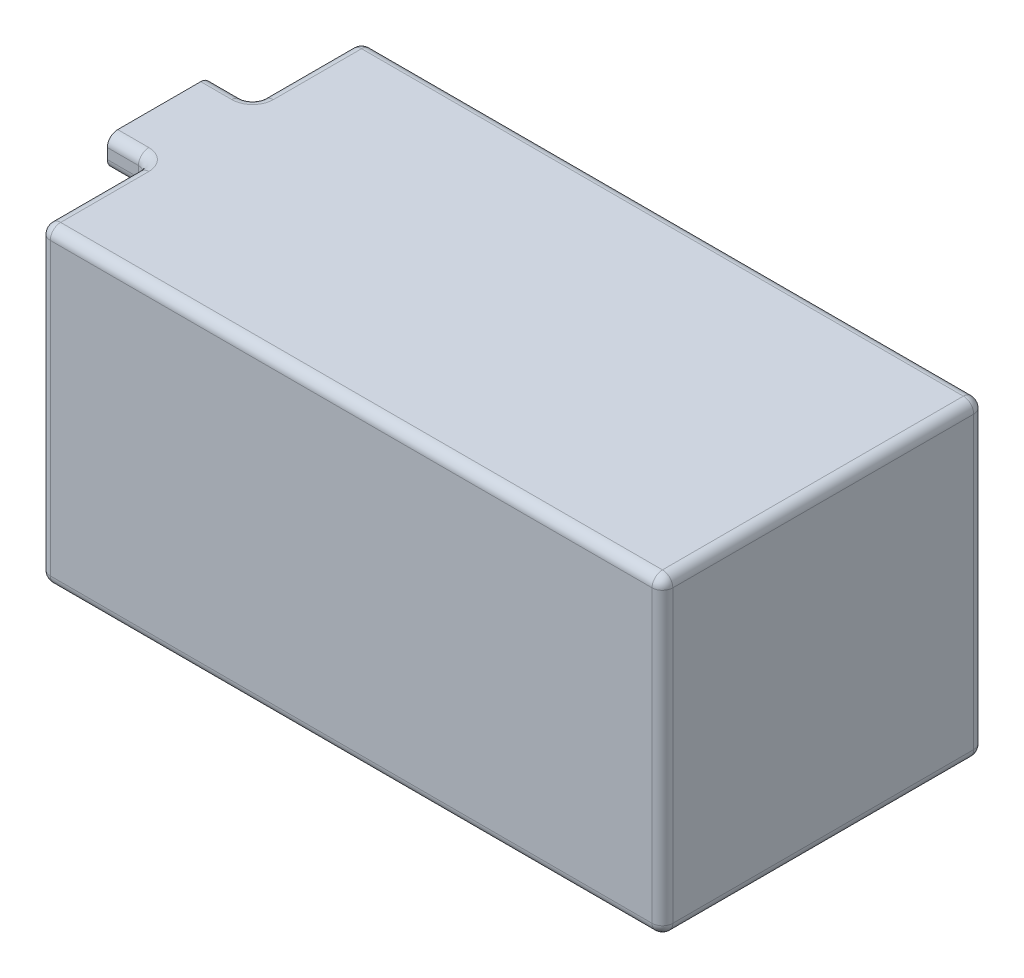
ISO-10303-21;
HEADER;
FILE_DESCRIPTION(('STEP AP214'),'2;1');
FILE_NAME('part.step','',(''),(''),'','','');
FILE_SCHEMA(('AUTOMOTIVE_DESIGN { 1 0 10303 214 1 1 1 1 }'));
ENDSEC;
DATA;
#1=APPLICATION_CONTEXT('core data for automotive mechanical design processes');
#2=APPLICATION_PROTOCOL_DEFINITION('international standard','automotive_design',2000,#1);
#3=PRODUCT_CONTEXT('',#1,'mechanical');
#4=PRODUCT('Part','Part','',(#3));
#5=PRODUCT_RELATED_PRODUCT_CATEGORY('part','',(#4));
#6=PRODUCT_DEFINITION_FORMATION('','',#4);
#7=PRODUCT_DEFINITION_CONTEXT('part definition',#1,'design');
#8=PRODUCT_DEFINITION('design','',#6,#7);
#9=PRODUCT_DEFINITION_SHAPE('','',#8);
#10=(LENGTH_UNIT() NAMED_UNIT(*) SI_UNIT(.MILLI.,.METRE.));
#11=(NAMED_UNIT(*) PLANE_ANGLE_UNIT() SI_UNIT($,.RADIAN.));
#12=(NAMED_UNIT(*) SI_UNIT($,.STERADIAN.) SOLID_ANGLE_UNIT());
#13=UNCERTAINTY_MEASURE_WITH_UNIT(LENGTH_MEASURE(1.E-05),#10,'distance_accuracy_value','');
#14=(GEOMETRIC_REPRESENTATION_CONTEXT(3) GLOBAL_UNCERTAINTY_ASSIGNED_CONTEXT((#13)) GLOBAL_UNIT_ASSIGNED_CONTEXT((#10,
#11,#12)) REPRESENTATION_CONTEXT('',''));
#15=CARTESIAN_POINT('',(0.,0.,0.));
#16=DIRECTION('',(0.,0.,1.));
#17=DIRECTION('',(1.,0.,0.));
#18=AXIS2_PLACEMENT_3D('',#15,#16,#17);
#19=CARTESIAN_POINT('',(-38.1,38.1,19.685));
#20=DIRECTION('',(1.,0.,0.));
#21=DIRECTION('',(0.,0.,-1.));
#22=AXIS2_PLACEMENT_3D('',#19,#20,#21);
#23=PLANE('',#22);
#24=DIRECTION('',(0.,0.,1.));
#25=VECTOR('',#24,1.);
#26=CARTESIAN_POINT('',(-38.1,1.27,19.685));
#27=LINE('',#26,#25);
#28=CARTESIAN_POINT('',(-38.1,1.27,-18.415));
#29=VERTEX_POINT('',#28);
#30=CARTESIAN_POINT('',(-38.1,1.27,18.415));
#31=VERTEX_POINT('',#30);
#32=EDGE_CURVE('E271',#29,#31,#27,.T.);
#33=ORIENTED_EDGE('',*,*,#32,.T.);
#34=DIRECTION('',(0.,-1.,0.));
#35=VECTOR('',#34,1.);
#36=CARTESIAN_POINT('',(-38.1,38.1,18.415));
#37=LINE('',#36,#35);
#38=CARTESIAN_POINT('',(-38.1,36.83,18.415));
#39=VERTEX_POINT('',#38);
#40=EDGE_CURVE('E275',#31,#39,#37,.F.);
#41=ORIENTED_EDGE('',*,*,#40,.T.);
#42=DIRECTION('',(0.,0.,1.));
#43=VECTOR('',#42,1.);
#44=CARTESIAN_POINT('',(-38.1,36.83,19.685));
#45=LINE('',#44,#43);
#46=CARTESIAN_POINT('',(-38.1,36.83,7.62));
#47=VERTEX_POINT('',#46);
#48=EDGE_CURVE('E273',#39,#47,#45,.F.);
#49=ORIENTED_EDGE('',*,*,#48,.T.);
#50=DIRECTION('',(0.,1.,0.));
#51=VECTOR('',#50,1.);
#52=CARTESIAN_POINT('',(-38.1,34.29,7.62));
#53=LINE('',#52,#51);
#54=CARTESIAN_POINT('',(-38.1,35.56,7.62));
#55=VERTEX_POINT('',#54);
#56=EDGE_CURVE('E266',#47,#55,#53,.F.);
#57=ORIENTED_EDGE('',*,*,#56,.T.);
#58=CARTESIAN_POINT('',(-38.1,35.56,5.08));
#59=DIRECTION('',(1.,0.,0.));
#60=DIRECTION('',(0.,0.,-1.));
#61=AXIS2_PLACEMENT_3D('',#58,#59,#60);
#62=CIRCLE('',#61,2.54);
#63=CARTESIAN_POINT('',(-38.1,33.02,5.08));
#64=VERTEX_POINT('',#63);
#65=EDGE_CURVE('E263',#64,#55,#62,.F.);
#66=ORIENTED_EDGE('',*,*,#65,.F.);
#67=DIRECTION('',(0.,0.,1.));
#68=VECTOR('',#67,1.);
#69=CARTESIAN_POINT('',(-38.1,33.02,-6.35));
#70=LINE('',#69,#68);
#71=CARTESIAN_POINT('',(-38.1,33.02,-5.08));
#72=VERTEX_POINT('',#71);
#73=EDGE_CURVE('E257',#64,#72,#70,.F.);
#74=ORIENTED_EDGE('',*,*,#73,.T.);
#75=CARTESIAN_POINT('',(-38.1,35.56,-5.08));
#76=DIRECTION('',(1.,0.,0.));
#77=DIRECTION('',(0.,0.,-1.));
#78=AXIS2_PLACEMENT_3D('',#75,#76,#77);
#79=CIRCLE('',#78,2.54);
#80=CARTESIAN_POINT('',(-38.1,35.56,-7.62));
#81=VERTEX_POINT('',#80);
#82=EDGE_CURVE('E254',#81,#72,#79,.F.);
#83=ORIENTED_EDGE('',*,*,#82,.F.);
#84=DIRECTION('',(0.,-1.,0.));
#85=VECTOR('',#84,1.);
#86=CARTESIAN_POINT('',(-38.1,38.1,-7.62000000000001));
#87=LINE('',#86,#85);
#88=CARTESIAN_POINT('',(-38.1,36.83,-7.62));
#89=VERTEX_POINT('',#88);
#90=EDGE_CURVE('E259',#81,#89,#87,.F.);
#91=ORIENTED_EDGE('',*,*,#90,.T.);
#92=DIRECTION('',(0.,0.,1.));
#93=VECTOR('',#92,1.);
#94=CARTESIAN_POINT('',(-38.1,36.83,19.685));
#95=LINE('',#94,#93);
#96=CARTESIAN_POINT('',(-38.1,36.83,-18.415));
#97=VERTEX_POINT('',#96);
#98=EDGE_CURVE('E261',#89,#97,#95,.F.);
#99=ORIENTED_EDGE('',*,*,#98,.T.);
#100=DIRECTION('',(0.,-1.,0.));
#101=VECTOR('',#100,1.);
#102=CARTESIAN_POINT('',(-38.1,38.1,-18.415));
#103=LINE('',#102,#101);
#104=EDGE_CURVE('E269',#97,#29,#103,.T.);
#105=ORIENTED_EDGE('',*,*,#104,.T.);
#106=EDGE_LOOP('',(#33,#41,#49,#57,#66,#74,#83,#91,#99,#105));
#107=FACE_BOUND('',#106,.T.);
#108=ADVANCED_FACE('F47',(#107),#23,.F.);
#109=CARTESIAN_POINT('',(38.1,38.1,19.685));
#110=DIRECTION('',(-1.,0.,0.));
#111=DIRECTION('',(0.,0.,1.));
#112=AXIS2_PLACEMENT_3D('',#109,#110,#111);
#113=PLANE('',#112);
#114=DIRECTION('',(0.,0.,-1.));
#115=VECTOR('',#114,1.);
#116=CARTESIAN_POINT('',(38.1,36.83,19.685));
#117=LINE('',#116,#115);
#118=CARTESIAN_POINT('',(38.1,36.83,-18.415));
#119=VERTEX_POINT('',#118);
#120=CARTESIAN_POINT('',(38.1,36.83,18.415));
#121=VERTEX_POINT('',#120);
#122=EDGE_CURVE('E290',#119,#121,#117,.F.);
#123=ORIENTED_EDGE('',*,*,#122,.T.);
#124=DIRECTION('',(0.,-1.,0.));
#125=VECTOR('',#124,1.);
#126=CARTESIAN_POINT('',(38.1,38.1,18.415));
#127=LINE('',#126,#125);
#128=CARTESIAN_POINT('',(38.1,1.27,18.415));
#129=VERTEX_POINT('',#128);
#130=EDGE_CURVE('E293',#121,#129,#127,.T.);
#131=ORIENTED_EDGE('',*,*,#130,.T.);
#132=DIRECTION('',(0.,0.,-1.));
#133=VECTOR('',#132,1.);
#134=CARTESIAN_POINT('',(38.1,1.27,-19.685));
#135=LINE('',#134,#133);
#136=CARTESIAN_POINT('',(38.1,1.27,-18.415));
#137=VERTEX_POINT('',#136);
#138=EDGE_CURVE('E288',#129,#137,#135,.T.);
#139=ORIENTED_EDGE('',*,*,#138,.T.);
#140=DIRECTION('',(0.,-1.,0.));
#141=VECTOR('',#140,1.);
#142=CARTESIAN_POINT('',(38.1,38.1,-18.415));
#143=LINE('',#142,#141);
#144=EDGE_CURVE('E286',#137,#119,#143,.F.);
#145=ORIENTED_EDGE('',*,*,#144,.T.);
#146=EDGE_LOOP('',(#123,#131,#139,#145));
#147=FACE_BOUND('',#146,.T.);
#148=ADVANCED_FACE('F547',(#147),#113,.F.);
#149=CARTESIAN_POINT('',(-38.1,38.1,-19.685));
#150=DIRECTION('',(0.,0.,1.));
#151=DIRECTION('',(1.,0.,0.));
#152=AXIS2_PLACEMENT_3D('',#149,#150,#151);
#153=PLANE('',#152);
#154=DIRECTION('',(-1.,0.,0.));
#155=VECTOR('',#154,1.);
#156=CARTESIAN_POINT('',(-38.1,36.83,-19.685));
#157=LINE('',#156,#155);
#158=CARTESIAN_POINT('',(-36.83,36.83,-19.685));
#159=VERTEX_POINT('',#158);
#160=CARTESIAN_POINT('',(36.83,36.83,-19.685));
#161=VERTEX_POINT('',#160);
#162=EDGE_CURVE('E308',#159,#161,#157,.F.);
#163=ORIENTED_EDGE('',*,*,#162,.T.);
#164=DIRECTION('',(0.,-1.,0.));
#165=VECTOR('',#164,1.);
#166=CARTESIAN_POINT('',(36.83,38.1,-19.685));
#167=LINE('',#166,#165);
#168=CARTESIAN_POINT('',(36.83,1.27,-19.685));
#169=VERTEX_POINT('',#168);
#170=EDGE_CURVE('E310',#161,#169,#167,.T.);
#171=ORIENTED_EDGE('',*,*,#170,.T.);
#172=DIRECTION('',(-1.,0.,0.));
#173=VECTOR('',#172,1.);
#174=CARTESIAN_POINT('',(-38.1,1.27,-19.685));
#175=LINE('',#174,#173);
#176=CARTESIAN_POINT('',(-36.83,1.27,-19.685));
#177=VERTEX_POINT('',#176);
#178=EDGE_CURVE('E304',#169,#177,#175,.T.);
#179=ORIENTED_EDGE('',*,*,#178,.T.);
#180=DIRECTION('',(0.,-1.,0.));
#181=VECTOR('',#180,1.);
#182=CARTESIAN_POINT('',(-36.83,38.1,-19.685));
#183=LINE('',#182,#181);
#184=EDGE_CURVE('E306',#177,#159,#183,.F.);
#185=ORIENTED_EDGE('',*,*,#184,.T.);
#186=EDGE_LOOP('',(#163,#171,#179,#185));
#187=FACE_BOUND('',#186,.T.);
#188=ADVANCED_FACE('F536',(#187),#153,.F.);
#189=CARTESIAN_POINT('',(-38.1,38.1,19.685));
#190=DIRECTION('',(0.,0.,-1.));
#191=DIRECTION('',(-1.,0.,0.));
#192=AXIS2_PLACEMENT_3D('',#189,#190,#191);
#193=PLANE('',#192);
#194=DIRECTION('',(1.,0.,0.));
#195=VECTOR('',#194,1.);
#196=CARTESIAN_POINT('',(-38.1,36.83,19.685));
#197=LINE('',#196,#195);
#198=CARTESIAN_POINT('',(36.83,36.83,19.685));
#199=VERTEX_POINT('',#198);
#200=CARTESIAN_POINT('',(-36.83,36.83,19.685));
#201=VERTEX_POINT('',#200);
#202=EDGE_CURVE('E299',#199,#201,#197,.F.);
#203=ORIENTED_EDGE('',*,*,#202,.T.);
#204=DIRECTION('',(0.,-1.,0.));
#205=VECTOR('',#204,1.);
#206=CARTESIAN_POINT('',(-36.83,38.1,19.685));
#207=LINE('',#206,#205);
#208=CARTESIAN_POINT('',(-36.83,1.27,19.685));
#209=VERTEX_POINT('',#208);
#210=EDGE_CURVE('E301',#201,#209,#207,.T.);
#211=ORIENTED_EDGE('',*,*,#210,.T.);
#212=DIRECTION('',(1.,0.,0.));
#213=VECTOR('',#212,1.);
#214=CARTESIAN_POINT('',(38.1,1.27,19.685));
#215=LINE('',#214,#213);
#216=CARTESIAN_POINT('',(36.83,1.27,19.685));
#217=VERTEX_POINT('',#216);
#218=EDGE_CURVE('E295',#209,#217,#215,.T.);
#219=ORIENTED_EDGE('',*,*,#218,.T.);
#220=DIRECTION('',(0.,-1.,0.));
#221=VECTOR('',#220,1.);
#222=CARTESIAN_POINT('',(36.83,38.1,19.685));
#223=LINE('',#222,#221);
#224=EDGE_CURVE('E297',#217,#199,#223,.F.);
#225=ORIENTED_EDGE('',*,*,#224,.T.);
#226=EDGE_LOOP('',(#203,#211,#219,#225));
#227=FACE_BOUND('',#226,.T.);
#228=ADVANCED_FACE('F516',(#227),#193,.F.);
#229=CARTESIAN_POINT('',(0.,38.1,0.));
#230=DIRECTION('',(0.,-1.,0.));
#231=DIRECTION('',(0.,0.,-1.));
#232=AXIS2_PLACEMENT_3D('',#229,#230,#231);
#233=PLANE('',#232);
#234=DIRECTION('',(0.,0.,-1.));
#235=VECTOR('',#234,1.);
#236=CARTESIAN_POINT('',(-43.18,38.1,-6.35));
#237=LINE('',#236,#235);
#238=CARTESIAN_POINT('',(-43.18,38.1,5.07999999999999));
#239=VERTEX_POINT('',#238);
#240=CARTESIAN_POINT('',(-43.18,38.1,-5.08));
#241=VERTEX_POINT('',#240);
#242=EDGE_CURVE('E211',#239,#241,#237,.T.);
#243=ORIENTED_EDGE('',*,*,#242,.F.);
#244=DIRECTION('',(1.,0.,0.));
#245=VECTOR('',#244,1.);
#246=CARTESIAN_POINT('',(0.,38.1,5.08));
#247=LINE('',#246,#245);
#248=CARTESIAN_POINT('',(-39.37,38.1,5.08));
#249=VERTEX_POINT('',#248);
#250=EDGE_CURVE('E224',#239,#249,#247,.T.);
#251=ORIENTED_EDGE('',*,*,#250,.T.);
#252=CARTESIAN_POINT('',(-39.37,38.1,7.62));
#253=DIRECTION('',(0.,-1.,0.));
#254=DIRECTION('',(0.,0.,-1.));
#255=AXIS2_PLACEMENT_3D('',#252,#253,#254);
#256=CIRCLE('',#255,2.54);
#257=CARTESIAN_POINT('',(-36.83,38.1,7.62));
#258=VERTEX_POINT('',#257);
#259=EDGE_CURVE('E234',#258,#249,#256,.F.);
#260=ORIENTED_EDGE('',*,*,#259,.F.);
#261=DIRECTION('',(0.,0.,1.));
#262=VECTOR('',#261,1.);
#263=CARTESIAN_POINT('',(-36.83,38.1,0.));
#264=LINE('',#263,#262);
#265=CARTESIAN_POINT('',(-36.83,38.1,18.415));
#266=VERTEX_POINT('',#265);
#267=EDGE_CURVE('E443',#258,#266,#264,.T.);
#268=ORIENTED_EDGE('',*,*,#267,.T.);
#269=DIRECTION('',(1.,0.,0.));
#270=VECTOR('',#269,1.);
#271=CARTESIAN_POINT('',(0.,38.1,18.415));
#272=LINE('',#271,#270);
#273=CARTESIAN_POINT('',(36.83,38.1,18.415));
#274=VERTEX_POINT('',#273);
#275=EDGE_CURVE('E438',#266,#274,#272,.T.);
#276=ORIENTED_EDGE('',*,*,#275,.T.);
#277=DIRECTION('',(0.,0.,-1.));
#278=VECTOR('',#277,1.);
#279=CARTESIAN_POINT('',(36.83,38.1,0.));
#280=LINE('',#279,#278);
#281=CARTESIAN_POINT('',(36.83,38.1,-18.415));
#282=VERTEX_POINT('',#281);
#283=EDGE_CURVE('E434',#274,#282,#280,.T.);
#284=ORIENTED_EDGE('',*,*,#283,.T.);
#285=DIRECTION('',(-1.,0.,0.));
#286=VECTOR('',#285,1.);
#287=CARTESIAN_POINT('',(0.,38.1,-18.415));
#288=LINE('',#287,#286);
#289=CARTESIAN_POINT('',(-36.83,38.1,-18.415));
#290=VERTEX_POINT('',#289);
#291=EDGE_CURVE('E227',#282,#290,#288,.T.);
#292=ORIENTED_EDGE('',*,*,#291,.T.);
#293=DIRECTION('',(0.,0.,1.));
#294=VECTOR('',#293,1.);
#295=CARTESIAN_POINT('',(-36.83,38.1,0.));
#296=LINE('',#295,#294);
#297=CARTESIAN_POINT('',(-36.83,38.1,-7.62));
#298=VERTEX_POINT('',#297);
#299=EDGE_CURVE('E436',#290,#298,#296,.T.);
#300=ORIENTED_EDGE('',*,*,#299,.T.);
#301=CARTESIAN_POINT('',(-39.37,38.1,-7.62));
#302=DIRECTION('',(0.,-1.,0.));
#303=DIRECTION('',(0.,0.,-1.));
#304=AXIS2_PLACEMENT_3D('',#301,#302,#303);
#305=CIRCLE('',#304,2.54);
#306=CARTESIAN_POINT('',(-39.37,38.1,-5.08));
#307=VERTEX_POINT('',#306);
#308=EDGE_CURVE('E440',#307,#298,#305,.F.);
#309=ORIENTED_EDGE('',*,*,#308,.F.);
#310=DIRECTION('',(1.,0.,0.));
#311=VECTOR('',#310,1.);
#312=CARTESIAN_POINT('',(0.,38.1,-5.08));
#313=LINE('',#312,#311);
#314=EDGE_CURVE('E226',#307,#241,#313,.F.);
#315=ORIENTED_EDGE('',*,*,#314,.T.);
#316=EDGE_LOOP('',(#243,#251,#260,#268,#276,#284,#292,#300,#309,#315));
#317=FACE_BOUND('',#316,.T.);
#318=ADVANCED_FACE('F223',(#317),#233,.F.);
#319=CARTESIAN_POINT('',(0.,0.,0.));
#320=DIRECTION('',(0.,-1.,0.));
#321=DIRECTION('',(0.,0.,-1.));
#322=AXIS2_PLACEMENT_3D('',#319,#320,#321);
#323=PLANE('',#322);
#324=DIRECTION('',(0.,0.,-1.));
#325=VECTOR('',#324,1.);
#326=CARTESIAN_POINT('',(36.83,0.,19.685));
#327=LINE('',#326,#325);
#328=CARTESIAN_POINT('',(36.83,0.,-18.415));
#329=VERTEX_POINT('',#328);
#330=CARTESIAN_POINT('',(36.83,0.,18.415));
#331=VERTEX_POINT('',#330);
#332=EDGE_CURVE('E279',#329,#331,#327,.F.);
#333=ORIENTED_EDGE('',*,*,#332,.T.);
#334=DIRECTION('',(1.,0.,0.));
#335=VECTOR('',#334,1.);
#336=CARTESIAN_POINT('',(-38.1,0.,18.415));
#337=LINE('',#336,#335);
#338=CARTESIAN_POINT('',(-36.83,0.,18.415));
#339=VERTEX_POINT('',#338);
#340=EDGE_CURVE('E284',#331,#339,#337,.F.);
#341=ORIENTED_EDGE('',*,*,#340,.T.);
#342=DIRECTION('',(0.,0.,1.));
#343=VECTOR('',#342,1.);
#344=CARTESIAN_POINT('',(-36.83,0.,-19.685));
#345=LINE('',#344,#343);
#346=CARTESIAN_POINT('',(-36.83,0.,-18.415));
#347=VERTEX_POINT('',#346);
#348=EDGE_CURVE('E281',#339,#347,#345,.F.);
#349=ORIENTED_EDGE('',*,*,#348,.T.);
#350=DIRECTION('',(-1.,0.,0.));
#351=VECTOR('',#350,1.);
#352=CARTESIAN_POINT('',(38.1,0.,-18.415));
#353=LINE('',#352,#351);
#354=EDGE_CURVE('E277',#347,#329,#353,.F.);
#355=ORIENTED_EDGE('',*,*,#354,.T.);
#356=EDGE_LOOP('',(#333,#341,#349,#355));
#357=FACE_BOUND('',#356,.T.);
#358=ADVANCED_FACE('F850',(#357),#323,.T.);
#359=CARTESIAN_POINT('',(-43.18,38.1,-6.35));
#360=DIRECTION('',(0.,0.,1.));
#361=DIRECTION('',(0.,-1.,0.));
#362=AXIS2_PLACEMENT_3D('',#359,#360,#361);
#363=PLANE('',#362);
#364=DIRECTION('',(0.,-1.,0.));
#365=VECTOR('',#364,1.);
#366=CARTESIAN_POINT('',(-43.18,38.1,-6.35));
#367=LINE('',#366,#365);
#368=CARTESIAN_POINT('',(-43.18,36.83,-6.35));
#369=VERTEX_POINT('',#368);
#370=CARTESIAN_POINT('',(-43.18,35.56,-6.35));
#371=VERTEX_POINT('',#370);
#372=EDGE_CURVE('E418',#369,#371,#367,.T.);
#373=ORIENTED_EDGE('',*,*,#372,.F.);
#374=DIRECTION('',(1.,0.,0.));
#375=VECTOR('',#374,1.);
#376=CARTESIAN_POINT('',(-43.18,36.83,-6.35));
#377=LINE('',#376,#375);
#378=CARTESIAN_POINT('',(-39.37,36.83,-6.35));
#379=VERTEX_POINT('',#378);
#380=EDGE_CURVE('E252',#369,#379,#377,.T.);
#381=ORIENTED_EDGE('',*,*,#380,.T.);
#382=DIRECTION('',(0.,-1.,0.));
#383=VECTOR('',#382,1.);
#384=CARTESIAN_POINT('',(-39.37,34.29,-6.35));
#385=LINE('',#384,#383);
#386=CARTESIAN_POINT('',(-39.37,35.56,-6.35));
#387=VERTEX_POINT('',#386);
#388=EDGE_CURVE('E250',#379,#387,#385,.T.);
#389=ORIENTED_EDGE('',*,*,#388,.T.);
#390=DIRECTION('',(1.,0.,0.));
#391=VECTOR('',#390,1.);
#392=CARTESIAN_POINT('',(-43.18,35.56,-6.35));
#393=LINE('',#392,#391);
#394=EDGE_CURVE('E218',#387,#371,#393,.F.);
#395=ORIENTED_EDGE('',*,*,#394,.T.);
#396=EDGE_LOOP('',(#373,#381,#389,#395));
#397=FACE_BOUND('',#396,.T.);
#398=ADVANCED_FACE('F843',(#397),#363,.F.);
#399=CARTESIAN_POINT('',(-43.18,34.29,-6.35));
#400=DIRECTION('',(0.,1.,0.));
#401=DIRECTION('',(0.,0.,1.));
#402=AXIS2_PLACEMENT_3D('',#399,#400,#401);
#403=PLANE('',#402);
#404=DIRECTION('',(0.,0.,1.));
#405=VECTOR('',#404,1.);
#406=CARTESIAN_POINT('',(-43.18,34.29,-6.35));
#407=LINE('',#406,#405);
#408=CARTESIAN_POINT('',(-43.18,34.29,-5.08));
#409=VERTEX_POINT('',#408);
#410=CARTESIAN_POINT('',(-43.18,34.29,5.08));
#411=VERTEX_POINT('',#410);
#412=EDGE_CURVE('E425',#409,#411,#407,.T.);
#413=ORIENTED_EDGE('',*,*,#412,.F.);
#414=DIRECTION('',(1.,0.,0.));
#415=VECTOR('',#414,1.);
#416=CARTESIAN_POINT('',(-43.18,34.29,-5.08));
#417=LINE('',#416,#415);
#418=CARTESIAN_POINT('',(-39.37,34.29,-5.08));
#419=VERTEX_POINT('',#418);
#420=EDGE_CURVE('E11',#409,#419,#417,.T.);
#421=ORIENTED_EDGE('',*,*,#420,.T.);
#422=DIRECTION('',(0.,0.,1.));
#423=VECTOR('',#422,1.);
#424=CARTESIAN_POINT('',(-39.37,34.29,6.35));
#425=LINE('',#424,#423);
#426=CARTESIAN_POINT('',(-39.37,34.29,5.08));
#427=VERTEX_POINT('',#426);
#428=EDGE_CURVE('E56',#419,#427,#425,.T.);
#429=ORIENTED_EDGE('',*,*,#428,.T.);
#430=DIRECTION('',(1.,0.,0.));
#431=VECTOR('',#430,1.);
#432=CARTESIAN_POINT('',(-43.18,34.29,5.08));
#433=LINE('',#432,#431);
#434=EDGE_CURVE('E313',#427,#411,#433,.F.);
#435=ORIENTED_EDGE('',*,*,#434,.T.);
#436=EDGE_LOOP('',(#413,#421,#429,#435));
#437=FACE_BOUND('',#436,.T.);
#438=ADVANCED_FACE('F834',(#437),#403,.F.);
#439=CARTESIAN_POINT('',(-43.18,38.1,6.35));
#440=DIRECTION('',(0.,0.,-1.));
#441=DIRECTION('',(-1.,0.,0.));
#442=AXIS2_PLACEMENT_3D('',#439,#440,#441);
#443=PLANE('',#442);
#444=DIRECTION('',(0.,1.,0.));
#445=VECTOR('',#444,1.);
#446=CARTESIAN_POINT('',(-39.37,38.1,6.35));
#447=LINE('',#446,#445);
#448=CARTESIAN_POINT('',(-39.37,35.56,6.35));
#449=VERTEX_POINT('',#448);
#450=CARTESIAN_POINT('',(-39.37,36.83,6.35));
#451=VERTEX_POINT('',#450);
#452=EDGE_CURVE('E236',#449,#451,#447,.T.);
#453=ORIENTED_EDGE('',*,*,#452,.T.);
#454=DIRECTION('',(1.,0.,0.));
#455=VECTOR('',#454,1.);
#456=CARTESIAN_POINT('',(-43.18,36.83,6.35));
#457=LINE('',#456,#455);
#458=CARTESIAN_POINT('',(-43.18,36.83,6.35));
#459=VERTEX_POINT('',#458);
#460=EDGE_CURVE('E242',#451,#459,#457,.F.);
#461=ORIENTED_EDGE('',*,*,#460,.T.);
#462=DIRECTION('',(0.,1.,0.));
#463=VECTOR('',#462,1.);
#464=CARTESIAN_POINT('',(-43.18,38.1,6.35));
#465=LINE('',#464,#463);
#466=CARTESIAN_POINT('',(-43.18,35.56,6.35));
#467=VERTEX_POINT('',#466);
#468=EDGE_CURVE('E214',#467,#459,#465,.T.);
#469=ORIENTED_EDGE('',*,*,#468,.F.);
#470=DIRECTION('',(1.,0.,0.));
#471=VECTOR('',#470,1.);
#472=CARTESIAN_POINT('',(-43.18,35.56,6.35));
#473=LINE('',#472,#471);
#474=EDGE_CURVE('E233',#467,#449,#473,.T.);
#475=ORIENTED_EDGE('',*,*,#474,.T.);
#476=EDGE_LOOP('',(#453,#461,#469,#475));
#477=FACE_BOUND('',#476,.T.);
#478=ADVANCED_FACE('F826',(#477),#443,.F.);
#479=CARTESIAN_POINT('',(-43.18,0.,0.));
#480=DIRECTION('',(-1.,0.,0.));
#481=DIRECTION('',(0.,0.,1.));
#482=AXIS2_PLACEMENT_3D('',#479,#480,#481);
#483=PLANE('',#482);
#484=ORIENTED_EDGE('',*,*,#468,.T.);
#485=CARTESIAN_POINT('',(-43.18,36.83,5.08));
#486=DIRECTION('',(-1.,0.,0.));
#487=DIRECTION('',(0.,0.,1.));
#488=AXIS2_PLACEMENT_3D('',#485,#486,#487);
#489=CIRCLE('',#488,1.27);
#490=EDGE_CURVE('E208',#459,#239,#489,.T.);
#491=ORIENTED_EDGE('',*,*,#490,.T.);
#492=ORIENTED_EDGE('',*,*,#242,.T.);
#493=CARTESIAN_POINT('',(-43.18,36.83,-5.08));
#494=DIRECTION('',(-1.,0.,0.));
#495=DIRECTION('',(0.,0.,1.));
#496=AXIS2_PLACEMENT_3D('',#493,#494,#495);
#497=CIRCLE('',#496,1.27);
#498=EDGE_CURVE('E219',#241,#369,#497,.T.);
#499=ORIENTED_EDGE('',*,*,#498,.T.);
#500=ORIENTED_EDGE('',*,*,#372,.T.);
#501=CARTESIAN_POINT('',(-43.18,35.56,-5.08));
#502=DIRECTION('',(-1.,0.,0.));
#503=DIRECTION('',(0.,0.,1.));
#504=AXIS2_PLACEMENT_3D('',#501,#502,#503);
#505=CIRCLE('',#504,1.27);
#506=EDGE_CURVE('E246',#371,#409,#505,.T.);
#507=ORIENTED_EDGE('',*,*,#506,.T.);
#508=ORIENTED_EDGE('',*,*,#412,.T.);
#509=CARTESIAN_POINT('',(-43.18,35.56,5.08));
#510=DIRECTION('',(-1.,0.,0.));
#511=DIRECTION('',(0.,0.,1.));
#512=AXIS2_PLACEMENT_3D('',#509,#510,#511);
#513=CIRCLE('',#512,1.27);
#514=EDGE_CURVE('E244',#411,#467,#513,.T.);
#515=ORIENTED_EDGE('',*,*,#514,.T.);
#516=EDGE_LOOP('',(#484,#491,#492,#499,#500,#507,#508,#515));
#517=FACE_BOUND('',#516,.T.);
#518=ADVANCED_FACE('F210',(#517),#483,.T.);
#519=CARTESIAN_POINT('',(36.83,1.27,-18.415));
#520=DIRECTION('',(1.,0.,0.));
#521=DIRECTION('',(0.,1.,0.));
#522=AXIS2_PLACEMENT_3D('',#519,#520,#521);
#523=SPHERICAL_SURFACE('',#522,1.27);
#524=CARTESIAN_POINT('',(36.83,1.27,-18.415));
#525=DIRECTION('',(1.,0.,0.));
#526=DIRECTION('',(0.,0.,-1.));
#527=AXIS2_PLACEMENT_3D('',#524,#525,#526);
#528=CIRCLE('',#527,1.27);
#529=EDGE_CURVE('E406',#169,#329,#528,.F.);
#530=ORIENTED_EDGE('',*,*,#529,.F.);
#531=CARTESIAN_POINT('',(36.83,1.27,-18.415));
#532=DIRECTION('',(0.,-1.,0.));
#533=DIRECTION('',(0.,0.,-1.));
#534=AXIS2_PLACEMENT_3D('',#531,#532,#533);
#535=CIRCLE('',#534,1.27);
#536=EDGE_CURVE('E411',#137,#169,#535,.F.);
#537=ORIENTED_EDGE('',*,*,#536,.F.);
#538=CARTESIAN_POINT('',(36.83,1.27,-18.415));
#539=DIRECTION('',(0.,0.,-1.));
#540=DIRECTION('',(-1.,0.,0.));
#541=AXIS2_PLACEMENT_3D('',#538,#539,#540);
#542=CIRCLE('',#541,1.27);
#543=EDGE_CURVE('E409',#329,#137,#542,.F.);
#544=ORIENTED_EDGE('',*,*,#543,.F.);
#545=EDGE_LOOP('',(#530,#537,#544));
#546=FACE_BOUND('',#545,.T.);
#547=ADVANCED_FACE('F49',(#546),#523,.T.);
#548=CARTESIAN_POINT('',(-36.83,36.83,-18.415));
#549=DIRECTION('',(0.,0.,-1.));
#550=DIRECTION('',(-1.,0.,0.));
#551=AXIS2_PLACEMENT_3D('',#548,#549,#550);
#552=SPHERICAL_SURFACE('',#551,1.27);
#553=CARTESIAN_POINT('',(-36.83,36.83,-18.415));
#554=DIRECTION('',(0.,0.,-1.));
#555=DIRECTION('',(-1.,0.,0.));
#556=AXIS2_PLACEMENT_3D('',#553,#554,#555);
#557=CIRCLE('',#556,1.27);
#558=EDGE_CURVE('E400',#290,#97,#557,.F.);
#559=ORIENTED_EDGE('',*,*,#558,.F.);
#560=CARTESIAN_POINT('',(-36.83,36.83,-18.415));
#561=DIRECTION('',(-1.,0.,0.));
#562=DIRECTION('',(0.,0.,1.));
#563=AXIS2_PLACEMENT_3D('',#560,#561,#562);
#564=CIRCLE('',#563,1.27);
#565=EDGE_CURVE('E51',#159,#290,#564,.F.);
#566=ORIENTED_EDGE('',*,*,#565,.F.);
#567=CARTESIAN_POINT('',(-36.83,36.83,-18.415));
#568=DIRECTION('',(0.,1.,0.));
#569=DIRECTION('',(0.,0.,1.));
#570=AXIS2_PLACEMENT_3D('',#567,#568,#569);
#571=CIRCLE('',#570,1.27);
#572=EDGE_CURVE('E403',#97,#159,#571,.F.);
#573=ORIENTED_EDGE('',*,*,#572,.F.);
#574=EDGE_LOOP('',(#559,#566,#573));
#575=FACE_BOUND('',#574,.T.);
#576=ADVANCED_FACE('F538',(#575),#552,.T.);
#577=CARTESIAN_POINT('',(0.,36.83,-18.415));
#578=DIRECTION('',(-1.,0.,0.));
#579=DIRECTION('',(0.,0.,1.));
#580=AXIS2_PLACEMENT_3D('',#577,#578,#579);
#581=CYLINDRICAL_SURFACE('',#580,1.27);
#582=ORIENTED_EDGE('',*,*,#565,.T.);
#583=ORIENTED_EDGE('',*,*,#291,.F.);
#584=CARTESIAN_POINT('',(36.83,36.83,-18.415));
#585=DIRECTION('',(1.,0.,0.));
#586=DIRECTION('',(0.,1.,0.));
#587=AXIS2_PLACEMENT_3D('',#584,#585,#586);
#588=CIRCLE('',#587,1.27);
#589=EDGE_CURVE('E397',#161,#282,#588,.T.);
#590=ORIENTED_EDGE('',*,*,#589,.F.);
#591=ORIENTED_EDGE('',*,*,#162,.F.);
#592=EDGE_LOOP('',(#582,#583,#590,#591));
#593=FACE_BOUND('',#592,.T.);
#594=ADVANCED_FACE('F530',(#593),#581,.T.);
#595=CARTESIAN_POINT('',(36.83,38.1,-18.415));
#596=DIRECTION('',(0.,-1.,0.));
#597=DIRECTION('',(0.,0.,-1.));
#598=AXIS2_PLACEMENT_3D('',#595,#596,#597);
#599=CYLINDRICAL_SURFACE('',#598,1.27);
#600=ORIENTED_EDGE('',*,*,#536,.T.);
#601=ORIENTED_EDGE('',*,*,#170,.F.);
#602=CARTESIAN_POINT('',(36.83,36.83,-18.415));
#603=DIRECTION('',(0.,1.,0.));
#604=DIRECTION('',(0.,0.,1.));
#605=AXIS2_PLACEMENT_3D('',#602,#603,#604);
#606=CIRCLE('',#605,1.27);
#607=EDGE_CURVE('E394',#119,#161,#606,.T.);
#608=ORIENTED_EDGE('',*,*,#607,.F.);
#609=ORIENTED_EDGE('',*,*,#144,.F.);
#610=EDGE_LOOP('',(#600,#601,#608,#609));
#611=FACE_BOUND('',#610,.T.);
#612=ADVANCED_FACE('F534',(#611),#599,.T.);
#613=CARTESIAN_POINT('',(36.83,1.27,19.685));
#614=DIRECTION('',(0.,0.,1.));
#615=DIRECTION('',(1.,0.,0.));
#616=AXIS2_PLACEMENT_3D('',#613,#614,#615);
#617=CYLINDRICAL_SURFACE('',#616,1.27);
#618=ORIENTED_EDGE('',*,*,#543,.T.);
#619=ORIENTED_EDGE('',*,*,#138,.F.);
#620=CARTESIAN_POINT('',(36.83,1.27,18.415));
#621=DIRECTION('',(0.,0.,1.));
#622=DIRECTION('',(1.,0.,0.));
#623=AXIS2_PLACEMENT_3D('',#620,#621,#622);
#624=CIRCLE('',#623,1.27);
#625=EDGE_CURVE('E391',#331,#129,#624,.T.);
#626=ORIENTED_EDGE('',*,*,#625,.F.);
#627=ORIENTED_EDGE('',*,*,#332,.F.);
#628=EDGE_LOOP('',(#618,#619,#626,#627));
#629=FACE_BOUND('',#628,.T.);
#630=ADVANCED_FACE('F626',(#629),#617,.T.);
#631=CARTESIAN_POINT('',(-38.1,1.27,-18.415));
#632=DIRECTION('',(1.,0.,0.));
#633=DIRECTION('',(0.,0.,-1.));
#634=AXIS2_PLACEMENT_3D('',#631,#632,#633);
#635=CYLINDRICAL_SURFACE('',#634,1.27);
#636=ORIENTED_EDGE('',*,*,#529,.T.);
#637=ORIENTED_EDGE('',*,*,#354,.F.);
#638=CARTESIAN_POINT('',(-36.83,1.27,-18.415));
#639=DIRECTION('',(-1.,0.,0.));
#640=DIRECTION('',(0.,0.,1.));
#641=AXIS2_PLACEMENT_3D('',#638,#639,#640);
#642=CIRCLE('',#641,1.27);
#643=EDGE_CURVE('E388',#177,#347,#642,.T.);
#644=ORIENTED_EDGE('',*,*,#643,.F.);
#645=ORIENTED_EDGE('',*,*,#178,.F.);
#646=EDGE_LOOP('',(#636,#637,#644,#645));
#647=FACE_BOUND('',#646,.T.);
#648=ADVANCED_FACE('F623',(#647),#635,.T.);
#649=CARTESIAN_POINT('',(-36.83,38.1,-18.415));
#650=DIRECTION('',(0.,-1.,0.));
#651=DIRECTION('',(0.,0.,-1.));
#652=AXIS2_PLACEMENT_3D('',#649,#650,#651);
#653=CYLINDRICAL_SURFACE('',#652,1.27);
#654=ORIENTED_EDGE('',*,*,#572,.T.);
#655=ORIENTED_EDGE('',*,*,#184,.F.);
#656=CARTESIAN_POINT('',(-36.83,1.27,-18.415));
#657=DIRECTION('',(0.,-1.,0.));
#658=DIRECTION('',(0.,0.,-1.));
#659=AXIS2_PLACEMENT_3D('',#656,#657,#658);
#660=CIRCLE('',#659,1.27);
#661=EDGE_CURVE('E385',#29,#177,#660,.T.);
#662=ORIENTED_EDGE('',*,*,#661,.F.);
#663=ORIENTED_EDGE('',*,*,#104,.F.);
#664=EDGE_LOOP('',(#654,#655,#662,#663));
#665=FACE_BOUND('',#664,.T.);
#666=ADVANCED_FACE('F499',(#665),#653,.T.);
#667=CARTESIAN_POINT('',(-36.83,36.83,0.));
#668=DIRECTION('',(0.,0.,1.));
#669=DIRECTION('',(1.,0.,0.));
#670=AXIS2_PLACEMENT_3D('',#667,#668,#669);
#671=CYLINDRICAL_SURFACE('',#670,1.27);
#672=ORIENTED_EDGE('',*,*,#558,.T.);
#673=ORIENTED_EDGE('',*,*,#98,.F.);
#674=CARTESIAN_POINT('',(-36.83,36.83,-7.62));
#675=DIRECTION('',(0.,0.,1.));
#676=DIRECTION('',(1.,0.,0.));
#677=AXIS2_PLACEMENT_3D('',#674,#675,#676);
#678=CIRCLE('',#677,1.27);
#679=EDGE_CURVE('E382',#298,#89,#678,.T.);
#680=ORIENTED_EDGE('',*,*,#679,.F.);
#681=ORIENTED_EDGE('',*,*,#299,.F.);
#682=EDGE_LOOP('',(#672,#673,#680,#681));
#683=FACE_BOUND('',#682,.T.);
#684=ADVANCED_FACE('F490',(#683),#671,.T.);
#685=CARTESIAN_POINT('',(-43.18,36.83,-5.08));
#686=DIRECTION('',(1.,0.,0.));
#687=DIRECTION('',(0.,0.,-1.));
#688=AXIS2_PLACEMENT_3D('',#685,#686,#687);
#689=CYLINDRICAL_SURFACE('',#688,1.27);
#690=ORIENTED_EDGE('',*,*,#498,.F.);
#691=ORIENTED_EDGE('',*,*,#314,.F.);
#692=CARTESIAN_POINT('',(-39.37,36.83,-5.08));
#693=DIRECTION('',(1.,0.,0.));
#694=DIRECTION('',(0.,0.,-1.));
#695=AXIS2_PLACEMENT_3D('',#692,#693,#694);
#696=CIRCLE('',#695,1.27);
#697=EDGE_CURVE('E379',#379,#307,#696,.T.);
#698=ORIENTED_EDGE('',*,*,#697,.F.);
#699=ORIENTED_EDGE('',*,*,#380,.F.);
#700=EDGE_LOOP('',(#690,#691,#698,#699));
#701=FACE_BOUND('',#700,.T.);
#702=ADVANCED_FACE('F615',(#701),#689,.T.);
#703=CARTESIAN_POINT('',(36.83,36.83,-18.415));
#704=DIRECTION('',(0.,0.,-1.));
#705=DIRECTION('',(-1.,0.,0.));
#706=AXIS2_PLACEMENT_3D('',#703,#704,#705);
#707=SPHERICAL_SURFACE('',#706,1.27);
#708=ORIENTED_EDGE('',*,*,#607,.T.);
#709=ORIENTED_EDGE('',*,*,#589,.T.);
#710=CARTESIAN_POINT('',(36.83,36.83,-18.415));
#711=DIRECTION('',(0.,0.,-1.));
#712=DIRECTION('',(-1.,0.,0.));
#713=AXIS2_PLACEMENT_3D('',#710,#711,#712);
#714=CIRCLE('',#713,1.27);
#715=EDGE_CURVE('E376',#119,#282,#714,.F.);
#716=ORIENTED_EDGE('',*,*,#715,.F.);
#717=EDGE_LOOP('',(#708,#709,#716));
#718=FACE_BOUND('',#717,.T.);
#719=ADVANCED_FACE('F532',(#718),#707,.T.);
#720=CARTESIAN_POINT('',(36.83,1.27,18.415));
#721=DIRECTION('',(1.,0.,0.));
#722=DIRECTION('',(0.,1.,0.));
#723=AXIS2_PLACEMENT_3D('',#720,#721,#722);
#724=SPHERICAL_SURFACE('',#723,1.27);
#725=CARTESIAN_POINT('',(36.83,1.27,18.415));
#726=DIRECTION('',(1.,0.,0.));
#727=DIRECTION('',(0.,0.,-1.));
#728=AXIS2_PLACEMENT_3D('',#725,#726,#727);
#729=CIRCLE('',#728,1.27);
#730=EDGE_CURVE('E370',#331,#217,#729,.F.);
#731=ORIENTED_EDGE('',*,*,#730,.F.);
#732=ORIENTED_EDGE('',*,*,#625,.T.);
#733=CARTESIAN_POINT('',(36.83,1.27,18.415));
#734=DIRECTION('',(0.,-1.,0.));
#735=DIRECTION('',(0.,0.,-1.));
#736=AXIS2_PLACEMENT_3D('',#733,#734,#735);
#737=CIRCLE('',#736,1.27);
#738=EDGE_CURVE('E373',#217,#129,#737,.F.);
#739=ORIENTED_EDGE('',*,*,#738,.F.);
#740=EDGE_LOOP('',(#731,#732,#739));
#741=FACE_BOUND('',#740,.T.);
#742=ADVANCED_FACE('F609',(#741),#724,.T.);
#743=CARTESIAN_POINT('',(-36.83,1.27,-18.415));
#744=DIRECTION('',(0.,0.,-1.));
#745=DIRECTION('',(0.,1.,0.));
#746=AXIS2_PLACEMENT_3D('',#743,#744,#745);
#747=SPHERICAL_SURFACE('',#746,1.27);
#748=ORIENTED_EDGE('',*,*,#661,.T.);
#749=ORIENTED_EDGE('',*,*,#643,.T.);
#750=CARTESIAN_POINT('',(-36.83,1.27,-18.415));
#751=DIRECTION('',(0.,0.,-1.));
#752=DIRECTION('',(-1.,0.,0.));
#753=AXIS2_PLACEMENT_3D('',#750,#751,#752);
#754=CIRCLE('',#753,1.27);
#755=EDGE_CURVE('E368',#29,#347,#754,.F.);
#756=ORIENTED_EDGE('',*,*,#755,.F.);
#757=EDGE_LOOP('',(#748,#749,#756));
#758=FACE_BOUND('',#757,.T.);
#759=ADVANCED_FACE('F502',(#758),#747,.T.);
#760=CARTESIAN_POINT('',(-39.37,36.83,-7.62));
#761=DIRECTION('',(0.,-1.,0.));
#762=DIRECTION('',(0.,0.,-1.));
#763=AXIS2_PLACEMENT_3D('',#760,#761,#762);
#764=TOROIDAL_SURFACE('',#763,2.54,1.27);
#765=ORIENTED_EDGE('',*,*,#308,.T.);
#766=ORIENTED_EDGE('',*,*,#679,.T.);
#767=CARTESIAN_POINT('',(-39.37,36.83,-7.62));
#768=DIRECTION('',(0.,-1.,0.));
#769=DIRECTION('',(0.,0.,-1.));
#770=AXIS2_PLACEMENT_3D('',#767,#768,#769);
#771=CIRCLE('',#770,1.27);
#772=EDGE_CURVE('E365',#379,#89,#771,.F.);
#773=ORIENTED_EDGE('',*,*,#772,.F.);
#774=ORIENTED_EDGE('',*,*,#697,.T.);
#775=EDGE_LOOP('',(#765,#766,#773,#774));
#776=FACE_BOUND('',#775,.T.);
#777=ADVANCED_FACE('F485',(#776),#764,.T.);
#778=CARTESIAN_POINT('',(36.83,36.83,0.));
#779=DIRECTION('',(0.,0.,-1.));
#780=DIRECTION('',(-1.,0.,0.));
#781=AXIS2_PLACEMENT_3D('',#778,#779,#780);
#782=CYLINDRICAL_SURFACE('',#781,1.27);
#783=ORIENTED_EDGE('',*,*,#715,.T.);
#784=ORIENTED_EDGE('',*,*,#283,.F.);
#785=CARTESIAN_POINT('',(36.83,36.83,18.415));
#786=DIRECTION('',(0.,0.,1.));
#787=DIRECTION('',(1.,0.,0.));
#788=AXIS2_PLACEMENT_3D('',#785,#786,#787);
#789=CIRCLE('',#788,1.27);
#790=EDGE_CURVE('E362',#121,#274,#789,.T.);
#791=ORIENTED_EDGE('',*,*,#790,.F.);
#792=ORIENTED_EDGE('',*,*,#122,.F.);
#793=EDGE_LOOP('',(#783,#784,#791,#792));
#794=FACE_BOUND('',#793,.T.);
#795=ADVANCED_FACE('F527',(#794),#782,.T.);
#796=CARTESIAN_POINT('',(36.83,38.1,18.415));
#797=DIRECTION('',(0.,-1.,0.));
#798=DIRECTION('',(0.,0.,-1.));
#799=AXIS2_PLACEMENT_3D('',#796,#797,#798);
#800=CYLINDRICAL_SURFACE('',#799,1.27);
#801=ORIENTED_EDGE('',*,*,#738,.T.);
#802=ORIENTED_EDGE('',*,*,#130,.F.);
#803=CARTESIAN_POINT('',(36.83,36.83,18.415));
#804=DIRECTION('',(0.,1.,0.));
#805=DIRECTION('',(0.,0.,1.));
#806=AXIS2_PLACEMENT_3D('',#803,#804,#805);
#807=CIRCLE('',#806,1.27);
#808=EDGE_CURVE('E360',#199,#121,#807,.T.);
#809=ORIENTED_EDGE('',*,*,#808,.F.);
#810=ORIENTED_EDGE('',*,*,#224,.F.);
#811=EDGE_LOOP('',(#801,#802,#809,#810));
#812=FACE_BOUND('',#811,.T.);
#813=ADVANCED_FACE('F521',(#812),#800,.T.);
#814=CARTESIAN_POINT('',(-38.1,1.27,18.415));
#815=DIRECTION('',(-1.,0.,0.));
#816=DIRECTION('',(0.,0.,1.));
#817=AXIS2_PLACEMENT_3D('',#814,#815,#816);
#818=CYLINDRICAL_SURFACE('',#817,1.27);
#819=ORIENTED_EDGE('',*,*,#730,.T.);
#820=ORIENTED_EDGE('',*,*,#218,.F.);
#821=CARTESIAN_POINT('',(-36.83,1.27,18.415));
#822=DIRECTION('',(-1.,0.,0.));
#823=DIRECTION('',(0.,0.,1.));
#824=AXIS2_PLACEMENT_3D('',#821,#822,#823);
#825=CIRCLE('',#824,1.27);
#826=EDGE_CURVE('E357',#339,#209,#825,.T.);
#827=ORIENTED_EDGE('',*,*,#826,.F.);
#828=ORIENTED_EDGE('',*,*,#340,.F.);
#829=EDGE_LOOP('',(#819,#820,#827,#828));
#830=FACE_BOUND('',#829,.T.);
#831=ADVANCED_FACE('F597',(#830),#818,.T.);
#832=CARTESIAN_POINT('',(-36.83,1.27,19.685));
#833=DIRECTION('',(0.,0.,-1.));
#834=DIRECTION('',(-1.,0.,0.));
#835=AXIS2_PLACEMENT_3D('',#832,#833,#834);
#836=CYLINDRICAL_SURFACE('',#835,1.27);
#837=ORIENTED_EDGE('',*,*,#755,.T.);
#838=ORIENTED_EDGE('',*,*,#348,.F.);
#839=CARTESIAN_POINT('',(-36.83,1.27,18.415));
#840=DIRECTION('',(0.,0.,1.));
#841=DIRECTION('',(1.,0.,0.));
#842=AXIS2_PLACEMENT_3D('',#839,#840,#841);
#843=CIRCLE('',#842,1.27);
#844=EDGE_CURVE('E354',#31,#339,#843,.T.);
#845=ORIENTED_EDGE('',*,*,#844,.F.);
#846=ORIENTED_EDGE('',*,*,#32,.F.);
#847=EDGE_LOOP('',(#837,#838,#845,#846));
#848=FACE_BOUND('',#847,.T.);
#849=ADVANCED_FACE('F506',(#848),#836,.T.);
#850=CARTESIAN_POINT('',(-39.37,38.1,-7.62000000000001));
#851=DIRECTION('',(0.,1.,0.));
#852=DIRECTION('',(0.,0.,1.));
#853=AXIS2_PLACEMENT_3D('',#850,#851,#852);
#854=CYLINDRICAL_SURFACE('',#853,1.27);
#855=ORIENTED_EDGE('',*,*,#772,.T.);
#856=ORIENTED_EDGE('',*,*,#90,.F.);
#857=CARTESIAN_POINT('',(-39.37,35.56,-7.62));
#858=DIRECTION('',(0.,1.,0.));
#859=DIRECTION('',(0.,0.,1.));
#860=AXIS2_PLACEMENT_3D('',#857,#858,#859);
#861=CIRCLE('',#860,1.27);
#862=EDGE_CURVE('E351',#387,#81,#861,.T.);
#863=ORIENTED_EDGE('',*,*,#862,.F.);
#864=ORIENTED_EDGE('',*,*,#388,.F.);
#865=EDGE_LOOP('',(#855,#856,#863,#864));
#866=FACE_BOUND('',#865,.T.);
#867=ADVANCED_FACE('F481',(#866),#854,.F.);
#868=CARTESIAN_POINT('',(-43.18,35.56,-5.08));
#869=DIRECTION('',(1.,0.,0.));
#870=DIRECTION('',(0.,0.,-1.));
#871=AXIS2_PLACEMENT_3D('',#868,#869,#870);
#872=CYLINDRICAL_SURFACE('',#871,1.27);
#873=ORIENTED_EDGE('',*,*,#506,.F.);
#874=ORIENTED_EDGE('',*,*,#394,.F.);
#875=CARTESIAN_POINT('',(-39.37,35.56,-5.08));
#876=DIRECTION('',(1.,0.,0.));
#877=DIRECTION('',(0.,0.,-1.));
#878=AXIS2_PLACEMENT_3D('',#875,#876,#877);
#879=CIRCLE('',#878,1.27);
#880=EDGE_CURVE('E348',#419,#387,#879,.T.);
#881=ORIENTED_EDGE('',*,*,#880,.F.);
#882=ORIENTED_EDGE('',*,*,#420,.F.);
#883=EDGE_LOOP('',(#873,#874,#881,#882));
#884=FACE_BOUND('',#883,.T.);
#885=ADVANCED_FACE('F589',(#884),#872,.T.);
#886=CARTESIAN_POINT('',(36.83,36.83,18.415));
#887=DIRECTION('',(1.,0.,0.));
#888=DIRECTION('',(0.,0.,-1.));
#889=AXIS2_PLACEMENT_3D('',#886,#887,#888);
#890=SPHERICAL_SURFACE('',#889,1.27);
#891=ORIENTED_EDGE('',*,*,#808,.T.);
#892=ORIENTED_EDGE('',*,*,#790,.T.);
#893=CARTESIAN_POINT('',(36.83,36.83,18.415));
#894=DIRECTION('',(1.,0.,0.));
#895=DIRECTION('',(0.,0.,-1.));
#896=AXIS2_PLACEMENT_3D('',#893,#894,#895);
#897=CIRCLE('',#896,1.27);
#898=EDGE_CURVE('E345',#199,#274,#897,.F.);
#899=ORIENTED_EDGE('',*,*,#898,.F.);
#900=EDGE_LOOP('',(#891,#892,#899));
#901=FACE_BOUND('',#900,.T.);
#902=ADVANCED_FACE('F524',(#901),#890,.T.);
#903=CARTESIAN_POINT('',(-36.83,1.27,18.415));
#904=DIRECTION('',(0.,-1.,0.));
#905=DIRECTION('',(0.,0.,-1.));
#906=AXIS2_PLACEMENT_3D('',#903,#904,#905);
#907=SPHERICAL_SURFACE('',#906,1.27);
#908=ORIENTED_EDGE('',*,*,#844,.T.);
#909=ORIENTED_EDGE('',*,*,#826,.T.);
#910=CARTESIAN_POINT('',(-36.83,1.27,18.415));
#911=DIRECTION('',(0.,-1.,0.));
#912=DIRECTION('',(0.,0.,-1.));
#913=AXIS2_PLACEMENT_3D('',#910,#911,#912);
#914=CIRCLE('',#913,1.27);
#915=EDGE_CURVE('E343',#31,#209,#914,.F.);
#916=ORIENTED_EDGE('',*,*,#915,.F.);
#917=EDGE_LOOP('',(#908,#909,#916));
#918=FACE_BOUND('',#917,.T.);
#919=ADVANCED_FACE('F510',(#918),#907,.T.);
#920=CARTESIAN_POINT('',(-39.37,35.56,-5.08));
#921=DIRECTION('',(1.,0.,0.));
#922=DIRECTION('',(0.,0.,-1.));
#923=AXIS2_PLACEMENT_3D('',#920,#921,#922);
#924=TOROIDAL_SURFACE('',#923,2.54,1.27);
#925=ORIENTED_EDGE('',*,*,#862,.T.);
#926=ORIENTED_EDGE('',*,*,#82,.T.);
#927=CARTESIAN_POINT('',(-39.37,33.02,-5.08));
#928=DIRECTION('',(0.,0.,1.));
#929=DIRECTION('',(1.,0.,0.));
#930=AXIS2_PLACEMENT_3D('',#927,#928,#929);
#931=CIRCLE('',#930,1.27);
#932=EDGE_CURVE('E340',#419,#72,#931,.F.);
#933=ORIENTED_EDGE('',*,*,#932,.F.);
#934=ORIENTED_EDGE('',*,*,#880,.T.);
#935=EDGE_LOOP('',(#925,#926,#933,#934));
#936=FACE_BOUND('',#935,.T.);
#937=ADVANCED_FACE('F476',(#936),#924,.F.);
#938=CARTESIAN_POINT('',(0.,36.83,18.415));
#939=DIRECTION('',(1.,0.,0.));
#940=DIRECTION('',(0.,0.,-1.));
#941=AXIS2_PLACEMENT_3D('',#938,#939,#940);
#942=CYLINDRICAL_SURFACE('',#941,1.27);
#943=ORIENTED_EDGE('',*,*,#898,.T.);
#944=ORIENTED_EDGE('',*,*,#275,.F.);
#945=CARTESIAN_POINT('',(-36.83,36.83,18.415));
#946=DIRECTION('',(-1.,0.,0.));
#947=DIRECTION('',(0.,0.,1.));
#948=AXIS2_PLACEMENT_3D('',#945,#946,#947);
#949=CIRCLE('',#948,1.27);
#950=EDGE_CURVE('E337',#201,#266,#949,.T.);
#951=ORIENTED_EDGE('',*,*,#950,.F.);
#952=ORIENTED_EDGE('',*,*,#202,.F.);
#953=EDGE_LOOP('',(#943,#944,#951,#952));
#954=FACE_BOUND('',#953,.T.);
#955=ADVANCED_FACE('F451',(#954),#942,.T.);
#956=CARTESIAN_POINT('',(-36.83,38.1,18.415));
#957=DIRECTION('',(0.,-1.,0.));
#958=DIRECTION('',(0.,0.,-1.));
#959=AXIS2_PLACEMENT_3D('',#956,#957,#958);
#960=CYLINDRICAL_SURFACE('',#959,1.27);
#961=ORIENTED_EDGE('',*,*,#915,.T.);
#962=ORIENTED_EDGE('',*,*,#210,.F.);
#963=CARTESIAN_POINT('',(-36.83,36.83,18.415));
#964=DIRECTION('',(0.,1.,0.));
#965=DIRECTION('',(0.,0.,1.));
#966=AXIS2_PLACEMENT_3D('',#963,#964,#965);
#967=CIRCLE('',#966,1.27);
#968=EDGE_CURVE('E334',#39,#201,#967,.T.);
#969=ORIENTED_EDGE('',*,*,#968,.F.);
#970=ORIENTED_EDGE('',*,*,#40,.F.);
#971=EDGE_LOOP('',(#961,#962,#969,#970));
#972=FACE_BOUND('',#971,.T.);
#973=ADVANCED_FACE('F514',(#972),#960,.T.);
#974=CARTESIAN_POINT('',(-39.37,33.02,-6.35));
#975=DIRECTION('',(0.,0.,-1.));
#976=DIRECTION('',(-1.,0.,0.));
#977=AXIS2_PLACEMENT_3D('',#974,#975,#976);
#978=CYLINDRICAL_SURFACE('',#977,1.27);
#979=ORIENTED_EDGE('',*,*,#932,.T.);
#980=ORIENTED_EDGE('',*,*,#73,.F.);
#981=CARTESIAN_POINT('',(-39.37,33.02,5.08));
#982=DIRECTION('',(0.,0.,-1.));
#983=DIRECTION('',(-1.,0.,0.));
#984=AXIS2_PLACEMENT_3D('',#981,#982,#983);
#985=CIRCLE('',#984,1.27);
#986=EDGE_CURVE('E331',#427,#64,#985,.T.);
#987=ORIENTED_EDGE('',*,*,#986,.F.);
#988=ORIENTED_EDGE('',*,*,#428,.F.);
#989=EDGE_LOOP('',(#979,#980,#987,#988));
#990=FACE_BOUND('',#989,.T.);
#991=ADVANCED_FACE('F473',(#990),#978,.F.);
#992=CARTESIAN_POINT('',(-43.18,35.56,5.08));
#993=DIRECTION('',(1.,0.,0.));
#994=DIRECTION('',(0.,0.,-1.));
#995=AXIS2_PLACEMENT_3D('',#992,#993,#994);
#996=CYLINDRICAL_SURFACE('',#995,1.27);
#997=ORIENTED_EDGE('',*,*,#514,.F.);
#998=ORIENTED_EDGE('',*,*,#434,.F.);
#999=CARTESIAN_POINT('',(-39.37,35.56,5.08));
#1000=DIRECTION('',(1.,0.,0.));
#1001=DIRECTION('',(0.,0.,-1.));
#1002=AXIS2_PLACEMENT_3D('',#999,#1000,#1001);
#1003=CIRCLE('',#1002,1.27);
#1004=EDGE_CURVE('E328',#449,#427,#1003,.T.);
#1005=ORIENTED_EDGE('',*,*,#1004,.F.);
#1006=ORIENTED_EDGE('',*,*,#474,.F.);
#1007=EDGE_LOOP('',(#997,#998,#1005,#1006));
#1008=FACE_BOUND('',#1007,.T.);
#1009=ADVANCED_FACE('F573',(#1008),#996,.T.);
#1010=CARTESIAN_POINT('',(-36.83,36.83,18.415));
#1011=DIRECTION('',(0.,0.,1.));
#1012=DIRECTION('',(1.,0.,0.));
#1013=AXIS2_PLACEMENT_3D('',#1010,#1011,#1012);
#1014=SPHERICAL_SURFACE('',#1013,1.27);
#1015=ORIENTED_EDGE('',*,*,#968,.T.);
#1016=ORIENTED_EDGE('',*,*,#950,.T.);
#1017=CARTESIAN_POINT('',(-36.83,36.83,18.415));
#1018=DIRECTION('',(0.,0.,1.));
#1019=DIRECTION('',(1.,0.,0.));
#1020=AXIS2_PLACEMENT_3D('',#1017,#1018,#1019);
#1021=CIRCLE('',#1020,1.27);
#1022=EDGE_CURVE('E325',#39,#266,#1021,.F.);
#1023=ORIENTED_EDGE('',*,*,#1022,.F.);
#1024=EDGE_LOOP('',(#1015,#1016,#1023));
#1025=FACE_BOUND('',#1024,.T.);
#1026=ADVANCED_FACE('F456',(#1025),#1014,.T.);
#1027=CARTESIAN_POINT('',(-39.37,35.56,5.08));
#1028=DIRECTION('',(1.,0.,0.));
#1029=DIRECTION('',(0.,0.,-1.));
#1030=AXIS2_PLACEMENT_3D('',#1027,#1028,#1029);
#1031=TOROIDAL_SURFACE('',#1030,2.54,1.27);
#1032=ORIENTED_EDGE('',*,*,#986,.T.);
#1033=ORIENTED_EDGE('',*,*,#65,.T.);
#1034=CARTESIAN_POINT('',(-39.37,35.56,7.62));
#1035=DIRECTION('',(0.,1.,0.));
#1036=DIRECTION('',(0.,0.,1.));
#1037=AXIS2_PLACEMENT_3D('',#1034,#1035,#1036);
#1038=CIRCLE('',#1037,1.27);
#1039=EDGE_CURVE('E323',#449,#55,#1038,.F.);
#1040=ORIENTED_EDGE('',*,*,#1039,.F.);
#1041=ORIENTED_EDGE('',*,*,#1004,.T.);
#1042=EDGE_LOOP('',(#1032,#1033,#1040,#1041));
#1043=FACE_BOUND('',#1042,.T.);
#1044=ADVANCED_FACE('F469',(#1043),#1031,.F.);
#1045=CARTESIAN_POINT('',(-36.83,36.83,0.));
#1046=DIRECTION('',(0.,0.,1.));
#1047=DIRECTION('',(1.,0.,0.));
#1048=AXIS2_PLACEMENT_3D('',#1045,#1046,#1047);
#1049=CYLINDRICAL_SURFACE('',#1048,1.27);
#1050=ORIENTED_EDGE('',*,*,#1022,.T.);
#1051=ORIENTED_EDGE('',*,*,#267,.F.);
#1052=CARTESIAN_POINT('',(-36.83,36.83,7.62));
#1053=DIRECTION('',(0.,0.,-1.));
#1054=DIRECTION('',(-1.,0.,0.));
#1055=AXIS2_PLACEMENT_3D('',#1052,#1053,#1054);
#1056=CIRCLE('',#1055,1.27);
#1057=EDGE_CURVE('E320',#47,#258,#1056,.T.);
#1058=ORIENTED_EDGE('',*,*,#1057,.F.);
#1059=ORIENTED_EDGE('',*,*,#48,.F.);
#1060=EDGE_LOOP('',(#1050,#1051,#1058,#1059));
#1061=FACE_BOUND('',#1060,.T.);
#1062=ADVANCED_FACE('F459',(#1061),#1049,.T.);
#1063=CARTESIAN_POINT('',(-39.37,38.1,7.62));
#1064=DIRECTION('',(0.,-1.,0.));
#1065=DIRECTION('',(0.,0.,-1.));
#1066=AXIS2_PLACEMENT_3D('',#1063,#1064,#1065);
#1067=CYLINDRICAL_SURFACE('',#1066,1.27);
#1068=ORIENTED_EDGE('',*,*,#1039,.T.);
#1069=ORIENTED_EDGE('',*,*,#56,.F.);
#1070=CARTESIAN_POINT('',(-39.37,36.83,7.62));
#1071=DIRECTION('',(0.,-1.,0.));
#1072=DIRECTION('',(0.,0.,-1.));
#1073=AXIS2_PLACEMENT_3D('',#1070,#1071,#1072);
#1074=CIRCLE('',#1073,1.27);
#1075=EDGE_CURVE('E317',#451,#47,#1074,.T.);
#1076=ORIENTED_EDGE('',*,*,#1075,.F.);
#1077=ORIENTED_EDGE('',*,*,#452,.F.);
#1078=EDGE_LOOP('',(#1068,#1069,#1076,#1077));
#1079=FACE_BOUND('',#1078,.T.);
#1080=ADVANCED_FACE('F465',(#1079),#1067,.F.);
#1081=CARTESIAN_POINT('',(-39.37,36.83,7.62));
#1082=DIRECTION('',(0.,-1.,0.));
#1083=DIRECTION('',(0.,0.,-1.));
#1084=AXIS2_PLACEMENT_3D('',#1081,#1082,#1083);
#1085=TOROIDAL_SURFACE('',#1084,2.54,1.27);
#1086=ORIENTED_EDGE('',*,*,#1057,.T.);
#1087=ORIENTED_EDGE('',*,*,#259,.T.);
#1088=CARTESIAN_POINT('',(-39.37,36.83,5.08));
#1089=DIRECTION('',(1.,0.,0.));
#1090=DIRECTION('',(0.,0.,-1.));
#1091=AXIS2_PLACEMENT_3D('',#1088,#1089,#1090);
#1092=CIRCLE('',#1091,1.27);
#1093=EDGE_CURVE('E231',#451,#249,#1092,.F.);
#1094=ORIENTED_EDGE('',*,*,#1093,.F.);
#1095=ORIENTED_EDGE('',*,*,#1075,.T.);
#1096=EDGE_LOOP('',(#1086,#1087,#1094,#1095));
#1097=FACE_BOUND('',#1096,.T.);
#1098=ADVANCED_FACE('F561',(#1097),#1085,.T.);
#1099=CARTESIAN_POINT('',(0.,36.83,5.08));
#1100=DIRECTION('',(1.,0.,0.));
#1101=DIRECTION('',(0.,0.,-1.));
#1102=AXIS2_PLACEMENT_3D('',#1099,#1100,#1101);
#1103=CYLINDRICAL_SURFACE('',#1102,1.27);
#1104=ORIENTED_EDGE('',*,*,#490,.F.);
#1105=ORIENTED_EDGE('',*,*,#460,.F.);
#1106=ORIENTED_EDGE('',*,*,#1093,.T.);
#1107=ORIENTED_EDGE('',*,*,#250,.F.);
#1108=EDGE_LOOP('',(#1104,#1105,#1106,#1107));
#1109=FACE_BOUND('',#1108,.T.);
#1110=ADVANCED_FACE('F229',(#1109),#1103,.T.);
#1111=CLOSED_SHELL('',(#108,#148,#188,#228,#318,#358,#398,#438,#478,#518,#547,#576,#594,#612,
#630,#648,#666,#684,#702,#719,#742,#759,#777,#795,#813,#831,#849,#867,#885,#902,#919,#937,#955,
#973,#991,#1009,#1026,#1044,#1062,#1080,#1098,#1110));
#1112=MANIFOLD_SOLID_BREP('B2',#1111);
#1113=ADVANCED_BREP_SHAPE_REPRESENTATION('',(#18,#1112),#14);
#1114=SHAPE_DEFINITION_REPRESENTATION(#9,#1113);
ENDSEC;
END-ISO-10303-21;
